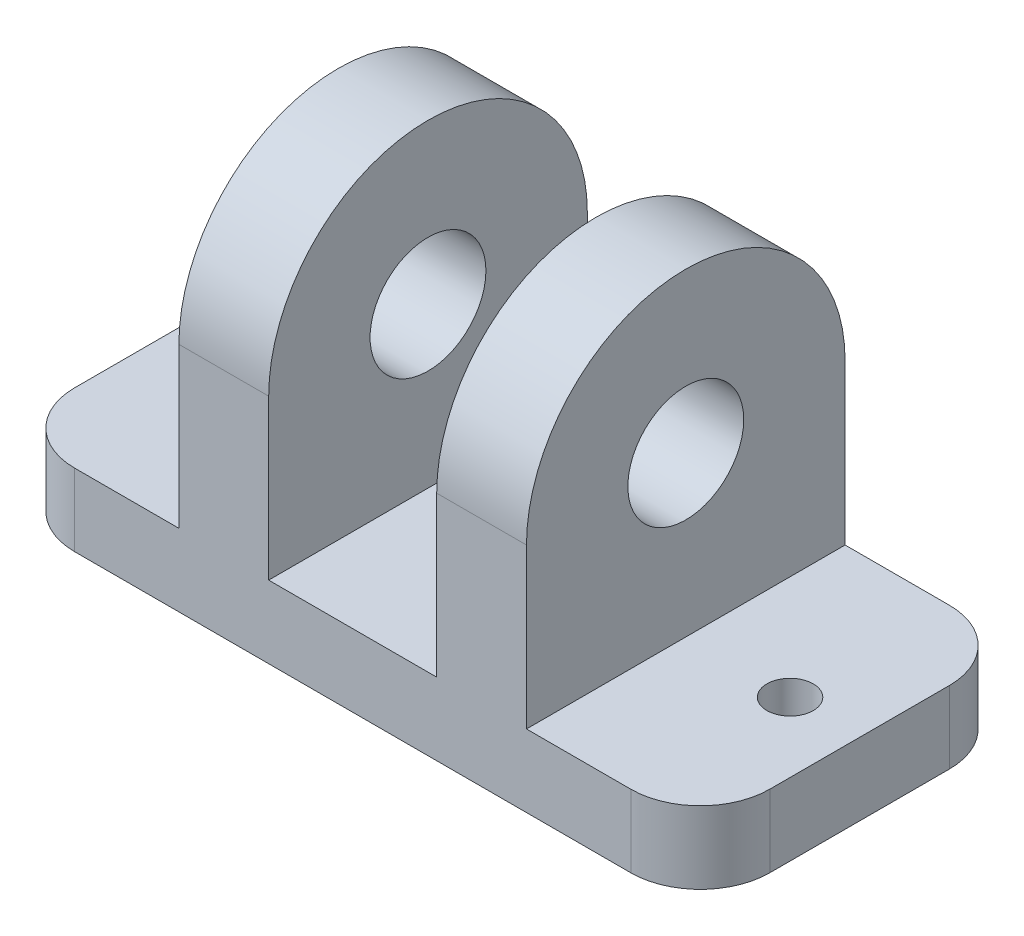
ISO-10303-21;
HEADER;
FILE_DESCRIPTION(('STEP AP214'),'2;1');
FILE_NAME('part.step','',(''),(''),'','','');
FILE_SCHEMA(('AUTOMOTIVE_DESIGN { 1 0 10303 214 1 1 1 1 }'));
ENDSEC;
DATA;
#1=APPLICATION_CONTEXT('core data for automotive mechanical design processes');
#2=APPLICATION_PROTOCOL_DEFINITION('international standard','automotive_design',2000,#1);
#3=PRODUCT_CONTEXT('',#1,'mechanical');
#4=PRODUCT('Part','Part','',(#3));
#5=PRODUCT_RELATED_PRODUCT_CATEGORY('part','',(#4));
#6=PRODUCT_DEFINITION_FORMATION('','',#4);
#7=PRODUCT_DEFINITION_CONTEXT('part definition',#1,'design');
#8=PRODUCT_DEFINITION('design','',#6,#7);
#9=PRODUCT_DEFINITION_SHAPE('','',#8);
#10=(LENGTH_UNIT() NAMED_UNIT(*) SI_UNIT(.MILLI.,.METRE.));
#11=(NAMED_UNIT(*) PLANE_ANGLE_UNIT() SI_UNIT($,.RADIAN.));
#12=(NAMED_UNIT(*) SI_UNIT($,.STERADIAN.) SOLID_ANGLE_UNIT());
#13=UNCERTAINTY_MEASURE_WITH_UNIT(LENGTH_MEASURE(1.E-05),#10,'distance_accuracy_value','');
#14=(GEOMETRIC_REPRESENTATION_CONTEXT(3) GLOBAL_UNCERTAINTY_ASSIGNED_CONTEXT((#13)) GLOBAL_UNIT_ASSIGNED_CONTEXT((#10,
#11,#12)) REPRESENTATION_CONTEXT('',''));
#15=CARTESIAN_POINT('',(0.,0.,0.));
#16=DIRECTION('',(0.,0.,1.));
#17=DIRECTION('',(1.,0.,0.));
#18=AXIS2_PLACEMENT_3D('',#15,#16,#17);
#19=CARTESIAN_POINT('',(-60.,-12.5,-27.5));
#20=DIRECTION('',(0.,0.,-1.));
#21=DIRECTION('',(-1.,0.,0.));
#22=AXIS2_PLACEMENT_3D('',#19,#20,#21);
#23=PLANE('',#22);
#24=DIRECTION('',(-1.,0.,0.));
#25=VECTOR('',#24,1.);
#26=CARTESIAN_POINT('',(-60.,0.,-27.5));
#27=LINE('',#26,#25);
#28=CARTESIAN_POINT('',(47.9999999999999,0.,-27.5));
#29=VERTEX_POINT('',#28);
#30=CARTESIAN_POINT('',(30.,0.,-27.5));
#31=VERTEX_POINT('',#30);
#32=EDGE_CURVE('E221',#29,#31,#27,.T.);
#33=ORIENTED_EDGE('',*,*,#32,.F.);
#34=DIRECTION('',(0.,1.,0.));
#35=VECTOR('',#34,1.);
#36=CARTESIAN_POINT('',(47.9999999999999,-12.5,-27.5));
#37=LINE('',#36,#35);
#38=CARTESIAN_POINT('',(47.9999999999999,-12.5,-27.5));
#39=VERTEX_POINT('',#38);
#40=EDGE_CURVE('E259',#39,#29,#37,.T.);
#41=ORIENTED_EDGE('',*,*,#40,.F.);
#42=DIRECTION('',(-1.,0.,0.));
#43=VECTOR('',#42,1.);
#44=CARTESIAN_POINT('',(-60.,-12.5,-27.5));
#45=LINE('',#44,#43);
#46=CARTESIAN_POINT('',(-48.,-12.5,-27.5));
#47=VERTEX_POINT('',#46);
#48=EDGE_CURVE('E212',#39,#47,#45,.T.);
#49=ORIENTED_EDGE('',*,*,#48,.T.);
#50=DIRECTION('',(0.,1.,0.));
#51=VECTOR('',#50,1.);
#52=CARTESIAN_POINT('',(-47.9999999999999,-12.5,-27.5));
#53=LINE('',#52,#51);
#54=CARTESIAN_POINT('',(-47.9999999999999,0.,-27.5));
#55=VERTEX_POINT('',#54);
#56=EDGE_CURVE('E89',#47,#55,#53,.T.);
#57=ORIENTED_EDGE('',*,*,#56,.T.);
#58=CARTESIAN_POINT('',(-30.,0.,-27.5));
#59=VERTEX_POINT('',#58);
#60=EDGE_CURVE('E219',#59,#55,#27,.T.);
#61=ORIENTED_EDGE('',*,*,#60,.F.);
#62=DIRECTION('',(0.,-1.,0.));
#63=VECTOR('',#62,1.);
#64=CARTESIAN_POINT('',(-30.,55.,-27.5));
#65=LINE('',#64,#63);
#66=CARTESIAN_POINT('',(-30.,27.5,-27.5));
#67=VERTEX_POINT('',#66);
#68=EDGE_CURVE('E301',#67,#59,#65,.T.);
#69=ORIENTED_EDGE('',*,*,#68,.F.);
#70=DIRECTION('',(1.,0.,0.));
#71=VECTOR('',#70,1.);
#72=CARTESIAN_POINT('',(-60.,27.5,-27.5));
#73=LINE('',#72,#71);
#74=CARTESIAN_POINT('',(-14.5000000000001,27.5,-27.5));
#75=VERTEX_POINT('',#74);
#76=EDGE_CURVE('E14',#67,#75,#73,.T.);
#77=ORIENTED_EDGE('',*,*,#76,.T.);
#78=DIRECTION('',(0.,-1.,0.));
#79=VECTOR('',#78,1.);
#80=CARTESIAN_POINT('',(-14.5,55.,-27.5));
#81=LINE('',#80,#79);
#82=CARTESIAN_POINT('',(-14.5,0.,-27.5));
#83=VERTEX_POINT('',#82);
#84=EDGE_CURVE('E303',#75,#83,#81,.T.);
#85=ORIENTED_EDGE('',*,*,#84,.T.);
#86=CARTESIAN_POINT('',(14.5,0.,-27.5));
#87=VERTEX_POINT('',#86);
#88=EDGE_CURVE('E224',#87,#83,#27,.T.);
#89=ORIENTED_EDGE('',*,*,#88,.F.);
#90=DIRECTION('',(0.,-1.,0.));
#91=VECTOR('',#90,1.);
#92=CARTESIAN_POINT('',(14.5,55.,-27.5));
#93=LINE('',#92,#91);
#94=CARTESIAN_POINT('',(14.4999999999999,27.5,-27.5));
#95=VERTEX_POINT('',#94);
#96=EDGE_CURVE('E313',#95,#87,#93,.T.);
#97=ORIENTED_EDGE('',*,*,#96,.F.);
#98=CARTESIAN_POINT('',(30.,27.5,-27.5));
#99=VERTEX_POINT('',#98);
#100=EDGE_CURVE('E82',#95,#99,#73,.T.);
#101=ORIENTED_EDGE('',*,*,#100,.T.);
#102=DIRECTION('',(0.,-1.,0.));
#103=VECTOR('',#102,1.);
#104=CARTESIAN_POINT('',(30.,55.,-27.5));
#105=LINE('',#104,#103);
#106=EDGE_CURVE('E315',#99,#31,#105,.T.);
#107=ORIENTED_EDGE('',*,*,#106,.T.);
#108=EDGE_LOOP('',(#33,#41,#49,#57,#61,#69,#77,#85,#89,#97,#101,#107));
#109=FACE_BOUND('',#108,.T.);
#110=ADVANCED_FACE('F73',(#109),#23,.T.);
#111=CARTESIAN_POINT('',(0.,0.,0.));
#112=DIRECTION('',(0.,-1.,0.));
#113=DIRECTION('',(0.,0.,-1.));
#114=AXIS2_PLACEMENT_3D('',#111,#112,#113);
#115=PLANE('',#114);
#116=CARTESIAN_POINT('',(-48.,0.,0.));
#117=DIRECTION('',(0.,1.,0.));
#118=DIRECTION('',(0.,0.,1.));
#119=AXIS2_PLACEMENT_3D('',#116,#117,#118);
#120=CIRCLE('',#119,4.00000000000001);
#121=CARTESIAN_POINT('',(-48.,0.,4.00000000000001));
#122=VERTEX_POINT('',#121);
#123=EDGE_CURVE('E422',#122,#122,#120,.T.);
#124=ORIENTED_EDGE('',*,*,#123,.F.);
#125=EDGE_LOOP('',(#124));
#126=FACE_BOUND('',#125,.T.);
#127=DIRECTION('',(0.,0.,1.));
#128=VECTOR('',#127,1.);
#129=CARTESIAN_POINT('',(-60.,0.,27.5));
#130=LINE('',#129,#128);
#131=CARTESIAN_POINT('',(-60.,0.,-15.4999999999999));
#132=VERTEX_POINT('',#131);
#133=CARTESIAN_POINT('',(-60.,0.,15.4999999999999));
#134=VERTEX_POINT('',#133);
#135=EDGE_CURVE('E223',#132,#134,#130,.T.);
#136=ORIENTED_EDGE('',*,*,#135,.T.);
#137=CARTESIAN_POINT('',(-48.,0.,15.5));
#138=DIRECTION('',(0.,1.,0.));
#139=DIRECTION('',(0.,0.,1.));
#140=AXIS2_PLACEMENT_3D('',#137,#138,#139);
#141=CIRCLE('',#140,12.);
#142=CARTESIAN_POINT('',(-47.9999999999999,0.,27.5));
#143=VERTEX_POINT('',#142);
#144=EDGE_CURVE('E193',#143,#134,#141,.F.);
#145=ORIENTED_EDGE('',*,*,#144,.F.);
#146=DIRECTION('',(1.,0.,0.));
#147=VECTOR('',#146,1.);
#148=CARTESIAN_POINT('',(-60.,0.,27.5));
#149=LINE('',#148,#147);
#150=CARTESIAN_POINT('',(-30.,0.,27.5));
#151=VERTEX_POINT('',#150);
#152=EDGE_CURVE('E202',#143,#151,#149,.T.);
#153=ORIENTED_EDGE('',*,*,#152,.T.);
#154=DIRECTION('',(0.,0.,1.));
#155=VECTOR('',#154,1.);
#156=CARTESIAN_POINT('',(-30.,0.,-27.5));
#157=LINE('',#156,#155);
#158=EDGE_CURVE('E295',#59,#151,#157,.T.);
#159=ORIENTED_EDGE('',*,*,#158,.F.);
#160=ORIENTED_EDGE('',*,*,#60,.T.);
#161=CARTESIAN_POINT('',(-48.,0.,-15.5));
#162=DIRECTION('',(0.,1.,0.));
#163=DIRECTION('',(0.,0.,1.));
#164=AXIS2_PLACEMENT_3D('',#161,#162,#163);
#165=CIRCLE('',#164,12.);
#166=EDGE_CURVE('E270',#132,#55,#165,.F.);
#167=ORIENTED_EDGE('',*,*,#166,.F.);
#168=EDGE_LOOP('',(#136,#145,#153,#159,#160,#167));
#169=FACE_BOUND('',#168,.T.);
#170=ADVANCED_FACE('F332',(#126,#169),#115,.F.);
#171=CARTESIAN_POINT('',(48.,0.,0.));
#172=DIRECTION('',(0.,1.,0.));
#173=DIRECTION('',(0.,0.,1.));
#174=AXIS2_PLACEMENT_3D('',#171,#172,#173);
#175=CIRCLE('',#174,4.00000000000001);
#176=CARTESIAN_POINT('',(48.,0.,4.00000000000001));
#177=VERTEX_POINT('',#176);
#178=EDGE_CURVE('E417',#177,#177,#175,.T.);
#179=ORIENTED_EDGE('',*,*,#178,.F.);
#180=EDGE_LOOP('',(#179));
#181=FACE_BOUND('',#180,.T.);
#182=DIRECTION('',(0.,0.,-1.));
#183=VECTOR('',#182,1.);
#184=CARTESIAN_POINT('',(60.,0.,27.5));
#185=LINE('',#184,#183);
#186=CARTESIAN_POINT('',(60.,0.,15.4999999999999));
#187=VERTEX_POINT('',#186);
#188=CARTESIAN_POINT('',(60.,0.,-15.4999999999999));
#189=VERTEX_POINT('',#188);
#190=EDGE_CURVE('E216',#187,#189,#185,.T.);
#191=ORIENTED_EDGE('',*,*,#190,.T.);
#192=CARTESIAN_POINT('',(48.,0.,-15.5));
#193=DIRECTION('',(0.,1.,0.));
#194=DIRECTION('',(0.,0.,1.));
#195=AXIS2_PLACEMENT_3D('',#192,#193,#194);
#196=CIRCLE('',#195,12.);
#197=EDGE_CURVE('E260',#29,#189,#196,.F.);
#198=ORIENTED_EDGE('',*,*,#197,.F.);
#199=ORIENTED_EDGE('',*,*,#32,.T.);
#200=DIRECTION('',(0.,0.,-1.));
#201=VECTOR('',#200,1.);
#202=CARTESIAN_POINT('',(30.,0.,-27.5));
#203=LINE('',#202,#201);
#204=CARTESIAN_POINT('',(30.,0.,27.5));
#205=VERTEX_POINT('',#204);
#206=EDGE_CURVE('E244',#205,#31,#203,.T.);
#207=ORIENTED_EDGE('',*,*,#206,.F.);
#208=CARTESIAN_POINT('',(47.9999999999999,0.,27.5));
#209=VERTEX_POINT('',#208);
#210=EDGE_CURVE('E227',#205,#209,#149,.T.);
#211=ORIENTED_EDGE('',*,*,#210,.T.);
#212=CARTESIAN_POINT('',(48.,0.,15.5));
#213=DIRECTION('',(0.,1.,0.));
#214=DIRECTION('',(0.,0.,1.));
#215=AXIS2_PLACEMENT_3D('',#212,#213,#214);
#216=CIRCLE('',#215,12.);
#217=EDGE_CURVE('E241',#187,#209,#216,.F.);
#218=ORIENTED_EDGE('',*,*,#217,.F.);
#219=EDGE_LOOP('',(#191,#198,#199,#207,#211,#218));
#220=FACE_BOUND('',#219,.T.);
#221=ADVANCED_FACE('F240',(#181,#220),#115,.F.);
#222=CARTESIAN_POINT('',(60.,-12.5,27.5));
#223=DIRECTION('',(1.,0.,0.));
#224=DIRECTION('',(0.,0.,-1.));
#225=AXIS2_PLACEMENT_3D('',#222,#223,#224);
#226=PLANE('',#225);
#227=DIRECTION('',(0.,1.,0.));
#228=VECTOR('',#227,1.);
#229=CARTESIAN_POINT('',(60.,-12.5,-15.4999999999999));
#230=LINE('',#229,#228);
#231=CARTESIAN_POINT('',(60.,-12.5,-15.5));
#232=VERTEX_POINT('',#231);
#233=EDGE_CURVE('E263',#232,#189,#230,.T.);
#234=ORIENTED_EDGE('',*,*,#233,.T.);
#235=ORIENTED_EDGE('',*,*,#190,.F.);
#236=DIRECTION('',(0.,1.,0.));
#237=VECTOR('',#236,1.);
#238=CARTESIAN_POINT('',(60.,-12.5,15.4999999999999));
#239=LINE('',#238,#237);
#240=CARTESIAN_POINT('',(60.,-12.5,15.4999999999999));
#241=VERTEX_POINT('',#240);
#242=EDGE_CURVE('E250',#241,#187,#239,.T.);
#243=ORIENTED_EDGE('',*,*,#242,.F.);
#244=DIRECTION('',(0.,0.,-1.));
#245=VECTOR('',#244,1.);
#246=CARTESIAN_POINT('',(60.,-12.5,27.5));
#247=LINE('',#246,#245);
#248=EDGE_CURVE('E228',#241,#232,#247,.T.);
#249=ORIENTED_EDGE('',*,*,#248,.T.);
#250=EDGE_LOOP('',(#234,#235,#243,#249));
#251=FACE_BOUND('',#250,.T.);
#252=ADVANCED_FACE('F75',(#251),#226,.T.);
#253=CARTESIAN_POINT('',(-60.,-12.5,27.5));
#254=DIRECTION('',(0.,0.,1.));
#255=DIRECTION('',(1.,0.,0.));
#256=AXIS2_PLACEMENT_3D('',#253,#254,#255);
#257=PLANE('',#256);
#258=DIRECTION('',(0.,1.,0.));
#259=VECTOR('',#258,1.);
#260=CARTESIAN_POINT('',(47.9999999999999,-12.5,27.5));
#261=LINE('',#260,#259);
#262=CARTESIAN_POINT('',(48.,-12.5,27.5));
#263=VERTEX_POINT('',#262);
#264=EDGE_CURVE('E248',#263,#209,#261,.T.);
#265=ORIENTED_EDGE('',*,*,#264,.T.);
#266=ORIENTED_EDGE('',*,*,#210,.F.);
#267=DIRECTION('',(0.,-1.,0.));
#268=VECTOR('',#267,1.);
#269=CARTESIAN_POINT('',(30.,55.,27.5));
#270=LINE('',#269,#268);
#271=CARTESIAN_POINT('',(30.,27.5,27.5));
#272=VERTEX_POINT('',#271);
#273=EDGE_CURVE('E247',#272,#205,#270,.T.);
#274=ORIENTED_EDGE('',*,*,#273,.F.);
#275=DIRECTION('',(1.,0.,0.));
#276=VECTOR('',#275,1.);
#277=CARTESIAN_POINT('',(-60.,27.5,27.5));
#278=LINE('',#277,#276);
#279=CARTESIAN_POINT('',(14.4999999999999,27.5,27.5));
#280=VERTEX_POINT('',#279);
#281=EDGE_CURVE('E286',#280,#272,#278,.T.);
#282=ORIENTED_EDGE('',*,*,#281,.F.);
#283=DIRECTION('',(0.,-1.,0.));
#284=VECTOR('',#283,1.);
#285=CARTESIAN_POINT('',(14.5,55.,27.5));
#286=LINE('',#285,#284);
#287=CARTESIAN_POINT('',(14.5,0.,27.5));
#288=VERTEX_POINT('',#287);
#289=EDGE_CURVE('E220',#280,#288,#286,.T.);
#290=ORIENTED_EDGE('',*,*,#289,.T.);
#291=CARTESIAN_POINT('',(-14.5,0.,27.5));
#292=VERTEX_POINT('',#291);
#293=EDGE_CURVE('E229',#292,#288,#149,.T.);
#294=ORIENTED_EDGE('',*,*,#293,.F.);
#295=DIRECTION('',(0.,-1.,0.));
#296=VECTOR('',#295,1.);
#297=CARTESIAN_POINT('',(-14.5,55.,27.5));
#298=LINE('',#297,#296);
#299=CARTESIAN_POINT('',(-14.5,27.5,27.5));
#300=VERTEX_POINT('',#299);
#301=EDGE_CURVE('E305',#300,#292,#298,.T.);
#302=ORIENTED_EDGE('',*,*,#301,.F.);
#303=CARTESIAN_POINT('',(-30.,27.5,27.5));
#304=VERTEX_POINT('',#303);
#305=EDGE_CURVE('E288',#304,#300,#278,.T.);
#306=ORIENTED_EDGE('',*,*,#305,.F.);
#307=DIRECTION('',(0.,-1.,0.));
#308=VECTOR('',#307,1.);
#309=CARTESIAN_POINT('',(-30.,55.,27.5));
#310=LINE('',#309,#308);
#311=EDGE_CURVE('E307',#304,#151,#310,.T.);
#312=ORIENTED_EDGE('',*,*,#311,.T.);
#313=ORIENTED_EDGE('',*,*,#152,.F.);
#314=DIRECTION('',(0.,1.,0.));
#315=VECTOR('',#314,1.);
#316=CARTESIAN_POINT('',(-47.9999999999999,-12.5,27.5));
#317=LINE('',#316,#315);
#318=CARTESIAN_POINT('',(-47.9999999999999,-12.5,27.5));
#319=VERTEX_POINT('',#318);
#320=EDGE_CURVE('E187',#319,#143,#317,.T.);
#321=ORIENTED_EDGE('',*,*,#320,.F.);
#322=DIRECTION('',(1.,0.,0.));
#323=VECTOR('',#322,1.);
#324=CARTESIAN_POINT('',(-60.,-12.5,27.5));
#325=LINE('',#324,#323);
#326=EDGE_CURVE('E200',#319,#263,#325,.T.);
#327=ORIENTED_EDGE('',*,*,#326,.T.);
#328=EDGE_LOOP('',(#265,#266,#274,#282,#290,#294,#302,#306,#312,#313,#321,#327));
#329=FACE_BOUND('',#328,.T.);
#330=ADVANCED_FACE('F199',(#329),#257,.T.);
#331=CARTESIAN_POINT('',(-60.,-12.5,27.5));
#332=DIRECTION('',(-1.,0.,0.));
#333=DIRECTION('',(0.,0.,1.));
#334=AXIS2_PLACEMENT_3D('',#331,#332,#333);
#335=PLANE('',#334);
#336=DIRECTION('',(0.,1.,0.));
#337=VECTOR('',#336,1.);
#338=CARTESIAN_POINT('',(-60.,-12.5,15.4999999999999));
#339=LINE('',#338,#337);
#340=CARTESIAN_POINT('',(-60.,-12.5,15.5));
#341=VERTEX_POINT('',#340);
#342=EDGE_CURVE('E97',#341,#134,#339,.T.);
#343=ORIENTED_EDGE('',*,*,#342,.T.);
#344=ORIENTED_EDGE('',*,*,#135,.F.);
#345=DIRECTION('',(0.,1.,0.));
#346=VECTOR('',#345,1.);
#347=CARTESIAN_POINT('',(-60.,-12.5,-15.4999999999999));
#348=LINE('',#347,#346);
#349=CARTESIAN_POINT('',(-60.,-12.5,-15.4999999999999));
#350=VERTEX_POINT('',#349);
#351=EDGE_CURVE('E269',#350,#132,#348,.T.);
#352=ORIENTED_EDGE('',*,*,#351,.F.);
#353=DIRECTION('',(0.,0.,1.));
#354=VECTOR('',#353,1.);
#355=CARTESIAN_POINT('',(-60.,-12.5,27.5));
#356=LINE('',#355,#354);
#357=EDGE_CURVE('E209',#350,#341,#356,.T.);
#358=ORIENTED_EDGE('',*,*,#357,.T.);
#359=EDGE_LOOP('',(#343,#344,#352,#358));
#360=FACE_BOUND('',#359,.T.);
#361=ADVANCED_FACE('F331',(#360),#335,.T.);
#362=CARTESIAN_POINT('',(0.,-12.5,0.));
#363=DIRECTION('',(0.,-1.,0.));
#364=DIRECTION('',(0.,0.,-1.));
#365=AXIS2_PLACEMENT_3D('',#362,#363,#364);
#366=PLANE('',#365);
#367=CARTESIAN_POINT('',(-48.,-12.5,0.));
#368=DIRECTION('',(0.,1.,0.));
#369=DIRECTION('',(0.,0.,1.));
#370=AXIS2_PLACEMENT_3D('',#367,#368,#369);
#371=CIRCLE('',#370,4.00000000000001);
#372=CARTESIAN_POINT('',(-48.,-12.5,4.00000000000001));
#373=VERTEX_POINT('',#372);
#374=EDGE_CURVE('E262',#373,#373,#371,.T.);
#375=ORIENTED_EDGE('',*,*,#374,.T.);
#376=EDGE_LOOP('',(#375));
#377=FACE_BOUND('',#376,.T.);
#378=CARTESIAN_POINT('',(48.,-12.5,0.));
#379=DIRECTION('',(0.,1.,0.));
#380=DIRECTION('',(0.,0.,1.));
#381=AXIS2_PLACEMENT_3D('',#378,#379,#380);
#382=CIRCLE('',#381,4.00000000000001);
#383=CARTESIAN_POINT('',(48.,-12.5,4.00000000000001));
#384=VERTEX_POINT('',#383);
#385=EDGE_CURVE('E419',#384,#384,#382,.T.);
#386=ORIENTED_EDGE('',*,*,#385,.T.);
#387=EDGE_LOOP('',(#386));
#388=FACE_BOUND('',#387,.T.);
#389=CARTESIAN_POINT('',(48.,-12.5,-15.5));
#390=DIRECTION('',(0.,1.,0.));
#391=DIRECTION('',(0.,0.,1.));
#392=AXIS2_PLACEMENT_3D('',#389,#390,#391);
#393=CIRCLE('',#392,12.);
#394=EDGE_CURVE('E257',#39,#232,#393,.F.);
#395=ORIENTED_EDGE('',*,*,#394,.T.);
#396=ORIENTED_EDGE('',*,*,#248,.F.);
#397=CARTESIAN_POINT('',(48.,-12.5,15.5));
#398=DIRECTION('',(0.,1.,0.));
#399=DIRECTION('',(0.,0.,1.));
#400=AXIS2_PLACEMENT_3D('',#397,#398,#399);
#401=CIRCLE('',#400,12.);
#402=EDGE_CURVE('E208',#241,#263,#401,.F.);
#403=ORIENTED_EDGE('',*,*,#402,.T.);
#404=ORIENTED_EDGE('',*,*,#326,.F.);
#405=CARTESIAN_POINT('',(-48.,-12.5,15.5));
#406=DIRECTION('',(0.,1.,0.));
#407=DIRECTION('',(0.,0.,1.));
#408=AXIS2_PLACEMENT_3D('',#405,#406,#407);
#409=CIRCLE('',#408,12.);
#410=EDGE_CURVE('E184',#319,#341,#409,.F.);
#411=ORIENTED_EDGE('',*,*,#410,.T.);
#412=ORIENTED_EDGE('',*,*,#357,.F.);
#413=CARTESIAN_POINT('',(-48.,-12.5,-15.5));
#414=DIRECTION('',(0.,1.,0.));
#415=DIRECTION('',(0.,0.,1.));
#416=AXIS2_PLACEMENT_3D('',#413,#414,#415);
#417=CIRCLE('',#416,12.);
#418=EDGE_CURVE('E267',#350,#47,#417,.F.);
#419=ORIENTED_EDGE('',*,*,#418,.T.);
#420=ORIENTED_EDGE('',*,*,#48,.F.);
#421=EDGE_LOOP('',(#395,#396,#403,#404,#411,#412,#419,#420));
#422=FACE_BOUND('',#421,.T.);
#423=ADVANCED_FACE('F206',(#377,#388,#422),#366,.T.);
#424=CARTESIAN_POINT('',(14.5,55.,-27.5));
#425=DIRECTION('',(1.,0.,0.));
#426=DIRECTION('',(0.,0.,-1.));
#427=AXIS2_PLACEMENT_3D('',#424,#425,#426);
#428=PLANE('',#427);
#429=CARTESIAN_POINT('',(14.5,27.5,0.));
#430=DIRECTION('',(1.,0.,0.));
#431=DIRECTION('',(0.,0.,-1.));
#432=AXIS2_PLACEMENT_3D('',#429,#430,#431);
#433=CIRCLE('',#432,10.);
#434=CARTESIAN_POINT('',(14.4999999999999,27.5,-10.));
#435=VERTEX_POINT('',#434);
#436=EDGE_CURVE('E280',#435,#435,#433,.T.);
#437=ORIENTED_EDGE('',*,*,#436,.T.);
#438=EDGE_LOOP('',(#437));
#439=FACE_BOUND('',#438,.T.);
#440=CARTESIAN_POINT('',(14.5,27.5,0.));
#441=DIRECTION('',(1.,0.,0.));
#442=DIRECTION('',(0.,0.,-1.));
#443=AXIS2_PLACEMENT_3D('',#440,#441,#442);
#444=CIRCLE('',#443,27.5);
#445=EDGE_CURVE('E293',#95,#280,#444,.T.);
#446=ORIENTED_EDGE('',*,*,#445,.F.);
#447=ORIENTED_EDGE('',*,*,#96,.T.);
#448=DIRECTION('',(0.,0.,1.));
#449=VECTOR('',#448,1.);
#450=CARTESIAN_POINT('',(14.5,0.,-27.5));
#451=LINE('',#450,#449);
#452=EDGE_CURVE('E309',#87,#288,#451,.T.);
#453=ORIENTED_EDGE('',*,*,#452,.T.);
#454=ORIENTED_EDGE('',*,*,#289,.F.);
#455=EDGE_LOOP('',(#446,#447,#453,#454));
#456=FACE_BOUND('',#455,.T.);
#457=ADVANCED_FACE('F351',(#439,#456),#428,.F.);
#458=CARTESIAN_POINT('',(30.,55.,-27.5));
#459=DIRECTION('',(-1.,0.,0.));
#460=DIRECTION('',(0.,0.,1.));
#461=AXIS2_PLACEMENT_3D('',#458,#459,#460);
#462=PLANE('',#461);
#463=CARTESIAN_POINT('',(30.,27.5,0.));
#464=DIRECTION('',(1.,0.,0.));
#465=DIRECTION('',(0.,0.,-1.));
#466=AXIS2_PLACEMENT_3D('',#463,#464,#465);
#467=CIRCLE('',#466,10.);
#468=CARTESIAN_POINT('',(30.,27.5,-10.));
#469=VERTEX_POINT('',#468);
#470=EDGE_CURVE('E273',#469,#469,#467,.T.);
#471=ORIENTED_EDGE('',*,*,#470,.F.);
#472=EDGE_LOOP('',(#471));
#473=FACE_BOUND('',#472,.T.);
#474=ORIENTED_EDGE('',*,*,#106,.F.);
#475=CARTESIAN_POINT('',(30.,27.5,0.));
#476=DIRECTION('',(1.,0.,0.));
#477=DIRECTION('',(0.,0.,-1.));
#478=AXIS2_PLACEMENT_3D('',#475,#476,#477);
#479=CIRCLE('',#478,27.5);
#480=EDGE_CURVE('E283',#99,#272,#479,.T.);
#481=ORIENTED_EDGE('',*,*,#480,.T.);
#482=ORIENTED_EDGE('',*,*,#273,.T.);
#483=ORIENTED_EDGE('',*,*,#206,.T.);
#484=EDGE_LOOP('',(#474,#481,#482,#483));
#485=FACE_BOUND('',#484,.T.);
#486=ADVANCED_FACE('F356',(#473,#485),#462,.F.);
#487=CARTESIAN_POINT('',(-30.,55.,-27.5));
#488=DIRECTION('',(1.,0.,0.));
#489=DIRECTION('',(0.,0.,-1.));
#490=AXIS2_PLACEMENT_3D('',#487,#488,#489);
#491=PLANE('',#490);
#492=CARTESIAN_POINT('',(-30.,27.5,0.));
#493=DIRECTION('',(1.,0.,0.));
#494=DIRECTION('',(0.,0.,-1.));
#495=AXIS2_PLACEMENT_3D('',#492,#493,#494);
#496=CIRCLE('',#495,10.);
#497=CARTESIAN_POINT('',(-30.,27.5,-10.));
#498=VERTEX_POINT('',#497);
#499=EDGE_CURVE('E277',#498,#498,#496,.T.);
#500=ORIENTED_EDGE('',*,*,#499,.T.);
#501=EDGE_LOOP('',(#500));
#502=FACE_BOUND('',#501,.T.);
#503=CARTESIAN_POINT('',(-30.,27.5,0.));
#504=DIRECTION('',(1.,0.,0.));
#505=DIRECTION('',(0.,0.,-1.));
#506=AXIS2_PLACEMENT_3D('',#503,#504,#505);
#507=CIRCLE('',#506,27.5);
#508=EDGE_CURVE('E291',#67,#304,#507,.T.);
#509=ORIENTED_EDGE('',*,*,#508,.F.);
#510=ORIENTED_EDGE('',*,*,#68,.T.);
#511=ORIENTED_EDGE('',*,*,#158,.T.);
#512=ORIENTED_EDGE('',*,*,#311,.F.);
#513=EDGE_LOOP('',(#509,#510,#511,#512));
#514=FACE_BOUND('',#513,.T.);
#515=ADVANCED_FACE('F392',(#502,#514),#491,.F.);
#516=CARTESIAN_POINT('',(-14.5,55.,-27.5));
#517=DIRECTION('',(-1.,0.,0.));
#518=DIRECTION('',(0.,0.,1.));
#519=AXIS2_PLACEMENT_3D('',#516,#517,#518);
#520=PLANE('',#519);
#521=CARTESIAN_POINT('',(-14.5,27.5,0.));
#522=DIRECTION('',(-1.,0.,0.));
#523=DIRECTION('',(0.,0.,1.));
#524=AXIS2_PLACEMENT_3D('',#521,#522,#523);
#525=CIRCLE('',#524,10.);
#526=CARTESIAN_POINT('',(-14.5,27.5,-10.));
#527=VERTEX_POINT('',#526);
#528=EDGE_CURVE('E77',#527,#527,#525,.T.);
#529=ORIENTED_EDGE('',*,*,#528,.T.);
#530=EDGE_LOOP('',(#529));
#531=FACE_BOUND('',#530,.T.);
#532=ORIENTED_EDGE('',*,*,#84,.F.);
#533=CARTESIAN_POINT('',(-14.5,27.5,0.));
#534=DIRECTION('',(-1.,0.,0.));
#535=DIRECTION('',(0.,0.,1.));
#536=AXIS2_PLACEMENT_3D('',#533,#534,#535);
#537=CIRCLE('',#536,27.5);
#538=EDGE_CURVE('E289',#300,#75,#537,.T.);
#539=ORIENTED_EDGE('',*,*,#538,.F.);
#540=ORIENTED_EDGE('',*,*,#301,.T.);
#541=DIRECTION('',(0.,0.,-1.));
#542=VECTOR('',#541,1.);
#543=CARTESIAN_POINT('',(-14.5,0.,-27.5));
#544=LINE('',#543,#542);
#545=EDGE_CURVE('E298',#292,#83,#544,.T.);
#546=ORIENTED_EDGE('',*,*,#545,.T.);
#547=EDGE_LOOP('',(#532,#539,#540,#546));
#548=FACE_BOUND('',#547,.T.);
#549=ADVANCED_FACE('F344',(#531,#548),#520,.F.);
#550=ORIENTED_EDGE('',*,*,#545,.F.);
#551=ORIENTED_EDGE('',*,*,#293,.T.);
#552=ORIENTED_EDGE('',*,*,#452,.F.);
#553=ORIENTED_EDGE('',*,*,#88,.T.);
#554=EDGE_LOOP('',(#550,#551,#552,#553));
#555=FACE_BOUND('',#554,.T.);
#556=ADVANCED_FACE('F339',(#555),#115,.F.);
#557=CARTESIAN_POINT('',(-60.,27.5,0.));
#558=DIRECTION('',(1.,0.,0.));
#559=DIRECTION('',(0.,0.,-1.));
#560=AXIS2_PLACEMENT_3D('',#557,#558,#559);
#561=CYLINDRICAL_SURFACE('',#560,27.5);
#562=ORIENTED_EDGE('',*,*,#508,.T.);
#563=ORIENTED_EDGE('',*,*,#305,.T.);
#564=ORIENTED_EDGE('',*,*,#538,.T.);
#565=ORIENTED_EDGE('',*,*,#76,.F.);
#566=EDGE_LOOP('',(#562,#563,#564,#565));
#567=FACE_BOUND('',#566,.T.);
#568=ADVANCED_FACE('F360',(#567),#561,.T.);
#569=ORIENTED_EDGE('',*,*,#445,.T.);
#570=ORIENTED_EDGE('',*,*,#281,.T.);
#571=ORIENTED_EDGE('',*,*,#480,.F.);
#572=ORIENTED_EDGE('',*,*,#100,.F.);
#573=EDGE_LOOP('',(#569,#570,#571,#572));
#574=FACE_BOUND('',#573,.T.);
#575=ADVANCED_FACE('F357',(#574),#561,.T.);
#576=CARTESIAN_POINT('',(-60.,27.5,0.));
#577=DIRECTION('',(1.,0.,0.));
#578=DIRECTION('',(0.,0.,-1.));
#579=AXIS2_PLACEMENT_3D('',#576,#577,#578);
#580=CYLINDRICAL_SURFACE('',#579,10.);
#581=CARTESIAN_POINT('',(-14.5,27.5,-10.));
#582=CARTESIAN_POINT('',(-14.6614583333334,27.5,-10.));
#583=CARTESIAN_POINT('',(-14.8229166666667,27.5,-10.));
#584=CARTESIAN_POINT('',(-15.1458333333334,27.5,-10.));
#585=CARTESIAN_POINT('',(-15.3072916666667,27.5,-10.));
#586=CARTESIAN_POINT('',(-15.6302083333334,27.5,-10.));
#587=CARTESIAN_POINT('',(-15.7916666666667,27.5,-10.));
#588=CARTESIAN_POINT('',(-16.1145833333334,27.5,-10.));
#589=CARTESIAN_POINT('',(-16.2760416666667,27.5,-10.));
#590=CARTESIAN_POINT('',(-16.5989583333334,27.5,-10.));
#591=CARTESIAN_POINT('',(-16.7604166666667,27.5,-10.));
#592=CARTESIAN_POINT('',(-17.0833333333334,27.5,-10.));
#593=CARTESIAN_POINT('',(-17.2447916666667,27.5,-10.));
#594=CARTESIAN_POINT('',(-17.5677083333334,27.5,-10.));
#595=CARTESIAN_POINT('',(-17.7291666666667,27.5,-10.));
#596=CARTESIAN_POINT('',(-18.0520833333334,27.5,-10.));
#597=CARTESIAN_POINT('',(-18.2135416666667,27.5,-10.));
#598=CARTESIAN_POINT('',(-18.5364583333334,27.5,-10.));
#599=CARTESIAN_POINT('',(-18.6979166666667,27.5,-10.));
#600=CARTESIAN_POINT('',(-19.0208333333334,27.5,-10.));
#601=CARTESIAN_POINT('',(-19.1822916666667,27.5,-10.));
#602=CARTESIAN_POINT('',(-19.5052083333334,27.5,-10.));
#603=CARTESIAN_POINT('',(-19.6666666666667,27.5,-10.));
#604=CARTESIAN_POINT('',(-19.9895833333334,27.5,-10.));
#605=CARTESIAN_POINT('',(-20.1510416666667,27.5,-10.));
#606=CARTESIAN_POINT('',(-20.4739583333334,27.5,-10.));
#607=CARTESIAN_POINT('',(-20.6354166666667,27.5,-10.));
#608=CARTESIAN_POINT('',(-20.9583333333334,27.5,-10.));
#609=CARTESIAN_POINT('',(-21.1197916666667,27.5,-10.));
#610=CARTESIAN_POINT('',(-21.4427083333334,27.5,-10.));
#611=CARTESIAN_POINT('',(-21.6041666666667,27.5,-10.));
#612=CARTESIAN_POINT('',(-21.9270833333334,27.5,-10.));
#613=CARTESIAN_POINT('',(-22.0885416666667,27.5,-10.));
#614=CARTESIAN_POINT('',(-22.4114583333334,27.5,-10.));
#615=CARTESIAN_POINT('',(-22.5729166666667,27.5,-10.));
#616=CARTESIAN_POINT('',(-22.8958333333334,27.5,-10.));
#617=CARTESIAN_POINT('',(-23.0572916666667,27.5,-10.));
#618=CARTESIAN_POINT('',(-23.3802083333334,27.5,-10.));
#619=CARTESIAN_POINT('',(-23.5416666666667,27.5,-10.));
#620=CARTESIAN_POINT('',(-23.8645833333334,27.5,-10.));
#621=CARTESIAN_POINT('',(-24.0260416666667,27.5,-10.));
#622=CARTESIAN_POINT('',(-24.3489583333334,27.5,-10.));
#623=CARTESIAN_POINT('',(-24.5104166666667,27.5,-10.));
#624=CARTESIAN_POINT('',(-24.8333333333334,27.5,-10.));
#625=CARTESIAN_POINT('',(-24.9947916666667,27.5,-10.));
#626=CARTESIAN_POINT('',(-25.3177083333334,27.5,-10.));
#627=CARTESIAN_POINT('',(-25.4791666666667,27.5,-10.));
#628=CARTESIAN_POINT('',(-25.8020833333334,27.5,-10.));
#629=CARTESIAN_POINT('',(-25.9635416666667,27.5,-10.));
#630=CARTESIAN_POINT('',(-26.2864583333334,27.5,-10.));
#631=CARTESIAN_POINT('',(-26.4479166666667,27.5,-10.));
#632=CARTESIAN_POINT('',(-26.7708333333334,27.5,-10.));
#633=CARTESIAN_POINT('',(-26.9322916666667,27.5,-10.));
#634=CARTESIAN_POINT('',(-27.2552083333334,27.5,-10.));
#635=CARTESIAN_POINT('',(-27.4166666666667,27.5,-10.));
#636=CARTESIAN_POINT('',(-27.7395833333334,27.5,-10.));
#637=CARTESIAN_POINT('',(-27.9010416666667,27.5,-10.));
#638=CARTESIAN_POINT('',(-28.2239583333334,27.5,-10.));
#639=CARTESIAN_POINT('',(-28.3854166666667,27.5,-10.));
#640=CARTESIAN_POINT('',(-28.7083333333334,27.5,-10.));
#641=CARTESIAN_POINT('',(-28.8697916666667,27.5,-10.));
#642=CARTESIAN_POINT('',(-29.1927083333334,27.5,-10.));
#643=CARTESIAN_POINT('',(-29.3541666666667,27.5,-10.));
#644=CARTESIAN_POINT('',(-29.6770833333334,27.5,-10.));
#645=CARTESIAN_POINT('',(-29.8385416666667,27.5,-10.));
#646=CARTESIAN_POINT('',(-30.,27.5,-10.));
#647=B_SPLINE_CURVE_WITH_KNOTS('',3,(#581,#582,#583,#584,#585,#586,#587,#588,#589,#590,#591,
#592,#593,#594,#595,#596,#597,#598,#599,#600,#601,#602,#603,#604,#605,#606,#607,#608,#609,#610,
#611,#612,#613,#614,#615,#616,#617,#618,#619,#620,#621,#622,#623,#624,#625,#626,#627,#628,#629,
#630,#631,#632,#633,#634,#635,#636,#637,#638,#639,#640,#641,#642,#643,#644,#645,#646),
.UNSPECIFIED.,.F.,.F.,(4,2,2,2,2,2,2,2,2,2,2,2,2,2,2,2,2,2,2,2,2,2,2,2,2,2,2,2,2,2,2,2,4),(0.,
0.484375000000002,0.968749999999997,1.453125,1.9375,2.421875,2.90625,3.390625,3.875,4.359375,
4.84375,5.328125,5.8125,6.296875,6.78125,7.265625,7.75,8.234375,8.71875,9.203125,9.6875,
10.171875,10.65625,11.140625,11.625,12.109375,12.59375,13.078125,13.5625,14.046875,14.53125,
15.015625,15.5),.UNSPECIFIED.);
#648=EDGE_CURVE('BSEAM359',#527,#498,#647,.T.);
#649=ORIENTED_EDGE('',*,*,#528,.F.);
#650=ORIENTED_EDGE('',*,*,#499,.F.);
#651=ORIENTED_EDGE('',*,*,#648,.T.);
#652=ORIENTED_EDGE('',*,*,#648,.F.);
#653=EDGE_LOOP('',(#649,#651,#650,#652));
#654=FACE_BOUND('',#653,.T.);
#655=ADVANCED_FACE('F359',(#654),#580,.F.);
#656=CARTESIAN_POINT('',(30.,27.5,-10.));
#657=CARTESIAN_POINT('',(29.8385416666666,27.5,-10.));
#658=CARTESIAN_POINT('',(29.6770833333333,27.5,-10.));
#659=CARTESIAN_POINT('',(29.3541666666666,27.5,-10.));
#660=CARTESIAN_POINT('',(29.1927083333333,27.5,-10.));
#661=CARTESIAN_POINT('',(28.8697916666666,27.5,-10.));
#662=CARTESIAN_POINT('',(28.7083333333333,27.5,-10.));
#663=CARTESIAN_POINT('',(28.3854166666666,27.5,-10.));
#664=CARTESIAN_POINT('',(28.2239583333333,27.5,-10.));
#665=CARTESIAN_POINT('',(27.9010416666666,27.5,-10.));
#666=CARTESIAN_POINT('',(27.7395833333333,27.5,-10.));
#667=CARTESIAN_POINT('',(27.4166666666666,27.5,-10.));
#668=CARTESIAN_POINT('',(27.2552083333333,27.5,-10.));
#669=CARTESIAN_POINT('',(26.9322916666666,27.5,-10.));
#670=CARTESIAN_POINT('',(26.7708333333333,27.5,-10.));
#671=CARTESIAN_POINT('',(26.4479166666666,27.5,-10.));
#672=CARTESIAN_POINT('',(26.2864583333333,27.5,-10.));
#673=CARTESIAN_POINT('',(25.9635416666666,27.5,-10.));
#674=CARTESIAN_POINT('',(25.8020833333333,27.5,-10.));
#675=CARTESIAN_POINT('',(25.4791666666666,27.5,-10.));
#676=CARTESIAN_POINT('',(25.3177083333333,27.5,-10.));
#677=CARTESIAN_POINT('',(24.9947916666666,27.5,-10.));
#678=CARTESIAN_POINT('',(24.8333333333333,27.5,-10.));
#679=CARTESIAN_POINT('',(24.5104166666666,27.5,-10.));
#680=CARTESIAN_POINT('',(24.3489583333333,27.5,-10.));
#681=CARTESIAN_POINT('',(24.0260416666666,27.5,-10.));
#682=CARTESIAN_POINT('',(23.8645833333333,27.5,-10.));
#683=CARTESIAN_POINT('',(23.5416666666666,27.5,-10.));
#684=CARTESIAN_POINT('',(23.3802083333333,27.5,-10.));
#685=CARTESIAN_POINT('',(23.0572916666666,27.5,-10.));
#686=CARTESIAN_POINT('',(22.8958333333333,27.5,-10.));
#687=CARTESIAN_POINT('',(22.5729166666666,27.5,-10.));
#688=CARTESIAN_POINT('',(22.4114583333333,27.5,-10.));
#689=CARTESIAN_POINT('',(22.0885416666666,27.5,-10.));
#690=CARTESIAN_POINT('',(21.9270833333333,27.5,-10.));
#691=CARTESIAN_POINT('',(21.6041666666666,27.5,-10.));
#692=CARTESIAN_POINT('',(21.4427083333333,27.5,-10.));
#693=CARTESIAN_POINT('',(21.1197916666666,27.5,-10.));
#694=CARTESIAN_POINT('',(20.9583333333333,27.5,-10.));
#695=CARTESIAN_POINT('',(20.6354166666666,27.5,-10.));
#696=CARTESIAN_POINT('',(20.4739583333333,27.5,-10.));
#697=CARTESIAN_POINT('',(20.1510416666666,27.5,-10.));
#698=CARTESIAN_POINT('',(19.9895833333333,27.5,-10.));
#699=CARTESIAN_POINT('',(19.6666666666666,27.5,-10.));
#700=CARTESIAN_POINT('',(19.5052083333333,27.5,-10.));
#701=CARTESIAN_POINT('',(19.1822916666666,27.5,-10.));
#702=CARTESIAN_POINT('',(19.0208333333333,27.5,-10.));
#703=CARTESIAN_POINT('',(18.6979166666666,27.5,-10.));
#704=CARTESIAN_POINT('',(18.5364583333333,27.5,-10.));
#705=CARTESIAN_POINT('',(18.2135416666666,27.5,-10.));
#706=CARTESIAN_POINT('',(18.0520833333333,27.5,-10.));
#707=CARTESIAN_POINT('',(17.7291666666666,27.5,-10.));
#708=CARTESIAN_POINT('',(17.5677083333333,27.5,-10.));
#709=CARTESIAN_POINT('',(17.2447916666666,27.5,-10.));
#710=CARTESIAN_POINT('',(17.0833333333333,27.5,-10.));
#711=CARTESIAN_POINT('',(16.7604166666666,27.5,-10.));
#712=CARTESIAN_POINT('',(16.5989583333333,27.5,-10.));
#713=CARTESIAN_POINT('',(16.2760416666666,27.5,-10.));
#714=CARTESIAN_POINT('',(16.1145833333333,27.5,-10.));
#715=CARTESIAN_POINT('',(15.7916666666666,27.5,-10.));
#716=CARTESIAN_POINT('',(15.6302083333333,27.5,-10.));
#717=CARTESIAN_POINT('',(15.3072916666666,27.5,-10.));
#718=CARTESIAN_POINT('',(15.1458333333333,27.5,-10.));
#719=CARTESIAN_POINT('',(14.8229166666666,27.5,-10.));
#720=CARTESIAN_POINT('',(14.6614583333333,27.5,-10.));
#721=CARTESIAN_POINT('',(14.4999999999999,27.5,-10.));
#722=B_SPLINE_CURVE_WITH_KNOTS('',3,(#656,#657,#658,#659,#660,#661,#662,#663,#664,#665,#666,
#667,#668,#669,#670,#671,#672,#673,#674,#675,#676,#677,#678,#679,#680,#681,#682,#683,#684,#685,
#686,#687,#688,#689,#690,#691,#692,#693,#694,#695,#696,#697,#698,#699,#700,#701,#702,#703,#704,
#705,#706,#707,#708,#709,#710,#711,#712,#713,#714,#715,#716,#717,#718,#719,#720,#721),
.UNSPECIFIED.,.F.,.F.,(4,2,2,2,2,2,2,2,2,2,2,2,2,2,2,2,2,2,2,2,2,2,2,2,2,2,2,2,2,2,2,2,4),(0.,
0.484374999999995,0.968750000000004,1.453125,1.93750000000001,2.421875,2.90625,3.39062500000001,
3.875,4.359375,4.84375000000001,5.328125,5.8125,6.29687500000001,6.78125,7.26562500000001,
7.75000000000001,8.234375,8.71875000000001,9.20312500000001,9.68750000000002,10.171875,10.65625,
11.140625,11.625,12.109375,12.59375,13.078125,13.5625,14.046875,14.53125,15.015625,15.5),.UNSPECIFIED.);
#723=EDGE_CURVE('BSEAM366',#469,#435,#722,.T.);
#724=ORIENTED_EDGE('',*,*,#470,.T.);
#725=ORIENTED_EDGE('',*,*,#436,.F.);
#726=ORIENTED_EDGE('',*,*,#723,.T.);
#727=ORIENTED_EDGE('',*,*,#723,.F.);
#728=EDGE_LOOP('',(#724,#726,#725,#727));
#729=FACE_BOUND('',#728,.T.);
#730=ADVANCED_FACE('F366',(#729),#580,.F.);
#731=CARTESIAN_POINT('',(-48.,-12.5,-15.5));
#732=DIRECTION('',(0.,1.,0.));
#733=DIRECTION('',(0.,0.,1.));
#734=AXIS2_PLACEMENT_3D('',#731,#732,#733);
#735=CYLINDRICAL_SURFACE('',#734,12.);
#736=ORIENTED_EDGE('',*,*,#166,.T.);
#737=ORIENTED_EDGE('',*,*,#56,.F.);
#738=ORIENTED_EDGE('',*,*,#418,.F.);
#739=ORIENTED_EDGE('',*,*,#351,.T.);
#740=EDGE_LOOP('',(#736,#737,#738,#739));
#741=FACE_BOUND('',#740,.T.);
#742=ADVANCED_FACE('F327',(#741),#735,.T.);
#743=CARTESIAN_POINT('',(-48.,-12.5,15.5));
#744=DIRECTION('',(0.,1.,0.));
#745=DIRECTION('',(0.,0.,1.));
#746=AXIS2_PLACEMENT_3D('',#743,#744,#745);
#747=CYLINDRICAL_SURFACE('',#746,12.);
#748=ORIENTED_EDGE('',*,*,#144,.T.);
#749=ORIENTED_EDGE('',*,*,#342,.F.);
#750=ORIENTED_EDGE('',*,*,#410,.F.);
#751=ORIENTED_EDGE('',*,*,#320,.T.);
#752=EDGE_LOOP('',(#748,#749,#750,#751));
#753=FACE_BOUND('',#752,.T.);
#754=ADVANCED_FACE('F186',(#753),#747,.T.);
#755=CARTESIAN_POINT('',(48.,-12.5,15.5));
#756=DIRECTION('',(0.,1.,0.));
#757=DIRECTION('',(0.,0.,1.));
#758=AXIS2_PLACEMENT_3D('',#755,#756,#757);
#759=CYLINDRICAL_SURFACE('',#758,12.);
#760=ORIENTED_EDGE('',*,*,#217,.T.);
#761=ORIENTED_EDGE('',*,*,#264,.F.);
#762=ORIENTED_EDGE('',*,*,#402,.F.);
#763=ORIENTED_EDGE('',*,*,#242,.T.);
#764=EDGE_LOOP('',(#760,#761,#762,#763));
#765=FACE_BOUND('',#764,.T.);
#766=ADVANCED_FACE('F426',(#765),#759,.T.);
#767=CARTESIAN_POINT('',(48.,-12.5,-15.5));
#768=DIRECTION('',(0.,1.,0.));
#769=DIRECTION('',(0.,0.,1.));
#770=AXIS2_PLACEMENT_3D('',#767,#768,#769);
#771=CYLINDRICAL_SURFACE('',#770,12.);
#772=ORIENTED_EDGE('',*,*,#197,.T.);
#773=ORIENTED_EDGE('',*,*,#233,.F.);
#774=ORIENTED_EDGE('',*,*,#394,.F.);
#775=ORIENTED_EDGE('',*,*,#40,.T.);
#776=EDGE_LOOP('',(#772,#773,#774,#775));
#777=FACE_BOUND('',#776,.T.);
#778=ADVANCED_FACE('F430',(#777),#771,.T.);
#779=CARTESIAN_POINT('',(48.,-12.5,0.));
#780=DIRECTION('',(0.,1.,0.));
#781=DIRECTION('',(0.,0.,1.));
#782=AXIS2_PLACEMENT_3D('',#779,#780,#781);
#783=CYLINDRICAL_SURFACE('',#782,4.00000000000001);
#784=ORIENTED_EDGE('',*,*,#385,.F.);
#785=EDGE_LOOP('',(#784));
#786=FACE_BOUND('',#785,.T.);
#787=ORIENTED_EDGE('',*,*,#178,.T.);
#788=EDGE_LOOP('',(#787));
#789=FACE_BOUND('',#788,.T.);
#790=ADVANCED_FACE('F432',(#786,#789),#783,.F.);
#791=CARTESIAN_POINT('',(-48.,-12.5,0.));
#792=DIRECTION('',(0.,1.,0.));
#793=DIRECTION('',(0.,0.,1.));
#794=AXIS2_PLACEMENT_3D('',#791,#792,#793);
#795=CYLINDRICAL_SURFACE('',#794,4.00000000000001);
#796=ORIENTED_EDGE('',*,*,#374,.F.);
#797=EDGE_LOOP('',(#796));
#798=FACE_BOUND('',#797,.T.);
#799=ORIENTED_EDGE('',*,*,#123,.T.);
#800=EDGE_LOOP('',(#799));
#801=FACE_BOUND('',#800,.T.);
#802=ADVANCED_FACE('F438',(#798,#801),#795,.F.);
#803=CLOSED_SHELL('',(#110,#170,#221,#252,#330,#361,#423,#457,#486,#515,#549,#556,#568,#575,
#655,#730,#742,#754,#766,#778,#790,#802));
#804=MANIFOLD_SOLID_BREP('B2',#803);
#805=ADVANCED_BREP_SHAPE_REPRESENTATION('',(#18,#804),#14);
#806=SHAPE_DEFINITION_REPRESENTATION(#9,#805);
ENDSEC;
END-ISO-10303-21;
